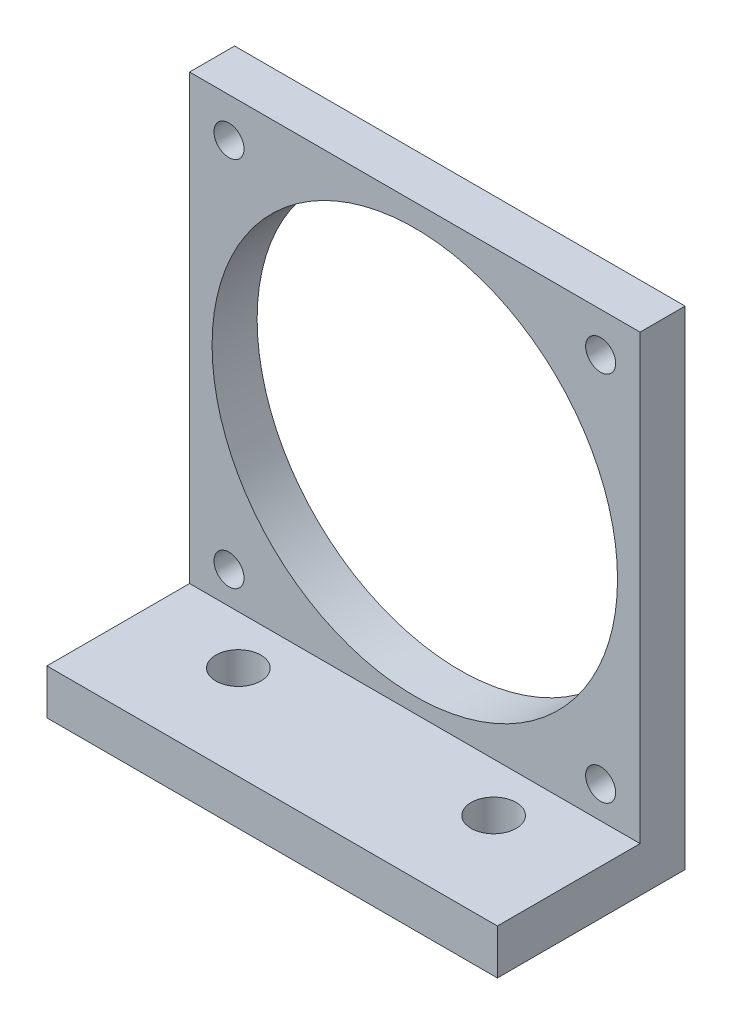
ISO-10303-21;
HEADER;
FILE_DESCRIPTION(('STEP AP214'),'2;1');
FILE_NAME('part.step','',(''),(''),'','','');
FILE_SCHEMA(('AUTOMOTIVE_DESIGN { 1 0 10303 214 1 1 1 1 }'));
ENDSEC;
DATA;
#1=APPLICATION_CONTEXT('core data for automotive mechanical design processes');
#2=APPLICATION_PROTOCOL_DEFINITION('international standard','automotive_design',2000,#1);
#3=PRODUCT_CONTEXT('',#1,'mechanical');
#4=PRODUCT('Part','Part','',(#3));
#5=PRODUCT_RELATED_PRODUCT_CATEGORY('part','',(#4));
#6=PRODUCT_DEFINITION_FORMATION('','',#4);
#7=PRODUCT_DEFINITION_CONTEXT('part definition',#1,'design');
#8=PRODUCT_DEFINITION('design','',#6,#7);
#9=PRODUCT_DEFINITION_SHAPE('','',#8);
#10=(LENGTH_UNIT() NAMED_UNIT(*) SI_UNIT(.MILLI.,.METRE.));
#11=(NAMED_UNIT(*) PLANE_ANGLE_UNIT() SI_UNIT($,.RADIAN.));
#12=(NAMED_UNIT(*) SI_UNIT($,.STERADIAN.) SOLID_ANGLE_UNIT());
#13=UNCERTAINTY_MEASURE_WITH_UNIT(LENGTH_MEASURE(1.E-05),#10,'distance_accuracy_value','');
#14=(GEOMETRIC_REPRESENTATION_CONTEXT(3) GLOBAL_UNCERTAINTY_ASSIGNED_CONTEXT((#13)) GLOBAL_UNIT_ASSIGNED_CONTEXT((#10,
#11,#12)) REPRESENTATION_CONTEXT('',''));
#15=CARTESIAN_POINT('',(0.,0.,0.));
#16=DIRECTION('',(0.,0.,1.));
#17=DIRECTION('',(1.,0.,0.));
#18=AXIS2_PLACEMENT_3D('',#15,#16,#17);
#19=CARTESIAN_POINT('',(0.,0.,6.));
#20=DIRECTION('',(0.,0.,-1.));
#21=DIRECTION('',(-1.,0.,0.));
#22=AXIS2_PLACEMENT_3D('',#19,#20,#21);
#23=PLANE('',#22);
#24=CARTESIAN_POINT('',(5.25126265847083,59.7487373415292,6.));
#25=DIRECTION('',(0.,0.,-1.));
#26=DIRECTION('',(-1.,0.,0.));
#27=AXIS2_PLACEMENT_3D('',#24,#25,#26);
#28=CIRCLE('',#27,2.);
#29=CARTESIAN_POINT('',(3.25126265847083,59.7487373415292,6.));
#30=VERTEX_POINT('',#29);
#31=EDGE_CURVE('E196',#30,#30,#28,.F.);
#32=ORIENTED_EDGE('',*,*,#31,.F.);
#33=EDGE_LOOP('',(#32));
#34=FACE_BOUND('',#33,.T.);
#35=CARTESIAN_POINT('',(54.7487373415292,10.2512626584708,6.));
#36=DIRECTION('',(0.,0.,-1.));
#37=DIRECTION('',(-1.,0.,0.));
#38=AXIS2_PLACEMENT_3D('',#35,#36,#37);
#39=CIRCLE('',#38,2.);
#40=CARTESIAN_POINT('',(52.7487373415292,10.2512626584708,6.));
#41=VERTEX_POINT('',#40);
#42=EDGE_CURVE('E197',#41,#41,#39,.F.);
#43=ORIENTED_EDGE('',*,*,#42,.F.);
#44=EDGE_LOOP('',(#43));
#45=FACE_BOUND('',#44,.T.);
#46=CARTESIAN_POINT('',(5.25126265847083,10.2512626584708,6.));
#47=DIRECTION('',(0.,0.,-1.));
#48=DIRECTION('',(-1.,0.,0.));
#49=AXIS2_PLACEMENT_3D('',#46,#47,#48);
#50=CIRCLE('',#49,2.);
#51=CARTESIAN_POINT('',(3.25126265847083,10.2512626584708,6.));
#52=VERTEX_POINT('',#51);
#53=EDGE_CURVE('E204',#52,#52,#50,.F.);
#54=ORIENTED_EDGE('',*,*,#53,.F.);
#55=EDGE_LOOP('',(#54));
#56=FACE_BOUND('',#55,.T.);
#57=CARTESIAN_POINT('',(54.7487373415292,59.7487373415292,6.));
#58=DIRECTION('',(0.,0.,-1.));
#59=DIRECTION('',(-1.,0.,0.));
#60=AXIS2_PLACEMENT_3D('',#57,#58,#59);
#61=CIRCLE('',#60,2.);
#62=CARTESIAN_POINT('',(52.7487373415292,59.7487373415292,6.));
#63=VERTEX_POINT('',#62);
#64=EDGE_CURVE('E209',#63,#63,#61,.F.);
#65=ORIENTED_EDGE('',*,*,#64,.F.);
#66=EDGE_LOOP('',(#65));
#67=FACE_BOUND('',#66,.T.);
#68=CARTESIAN_POINT('',(30.,35.,6.));
#69=DIRECTION('',(0.,0.,-1.));
#70=DIRECTION('',(-1.,0.,0.));
#71=AXIS2_PLACEMENT_3D('',#68,#69,#70);
#72=CIRCLE('',#71,27.);
#73=CARTESIAN_POINT('',(3.,35.,6.));
#74=VERTEX_POINT('',#73);
#75=EDGE_CURVE('E184',#74,#74,#72,.F.);
#76=ORIENTED_EDGE('',*,*,#75,.F.);
#77=EDGE_LOOP('',(#76));
#78=FACE_BOUND('',#77,.T.);
#79=DIRECTION('',(-1.,0.,0.));
#80=VECTOR('',#79,1.);
#81=CARTESIAN_POINT('',(0.,6.,6.));
#82=LINE('',#81,#80);
#83=CARTESIAN_POINT('',(60.,6.,6.));
#84=VERTEX_POINT('',#83);
#85=CARTESIAN_POINT('',(0.,6.,6.));
#86=VERTEX_POINT('',#85);
#87=EDGE_CURVE('E48',#84,#86,#82,.T.);
#88=ORIENTED_EDGE('',*,*,#87,.F.);
#89=DIRECTION('',(0.,1.,0.));
#90=VECTOR('',#89,1.);
#91=CARTESIAN_POINT('',(60.,0.,6.));
#92=LINE('',#91,#90);
#93=CARTESIAN_POINT('',(60.,65.,6.));
#94=VERTEX_POINT('',#93);
#95=EDGE_CURVE('E137',#84,#94,#92,.T.);
#96=ORIENTED_EDGE('',*,*,#95,.T.);
#97=DIRECTION('',(-1.,0.,0.));
#98=VECTOR('',#97,1.);
#99=CARTESIAN_POINT('',(0.,65.,6.));
#100=LINE('',#99,#98);
#101=CARTESIAN_POINT('',(0.,65.,6.));
#102=VERTEX_POINT('',#101);
#103=EDGE_CURVE('E54',#94,#102,#100,.T.);
#104=ORIENTED_EDGE('',*,*,#103,.T.);
#105=DIRECTION('',(0.,-1.,0.));
#106=VECTOR('',#105,1.);
#107=CARTESIAN_POINT('',(0.,0.,6.));
#108=LINE('',#107,#106);
#109=EDGE_CURVE('E83',#102,#86,#108,.T.);
#110=ORIENTED_EDGE('',*,*,#109,.T.);
#111=EDGE_LOOP('',(#88,#96,#104,#110));
#112=FACE_BOUND('',#111,.T.);
#113=ADVANCED_FACE('F33',(#34,#45,#56,#67,#78,#112),#23,.F.);
#114=CARTESIAN_POINT('',(0.,0.,6.));
#115=DIRECTION('',(1.,0.,0.));
#116=DIRECTION('',(0.,1.,0.));
#117=AXIS2_PLACEMENT_3D('',#114,#115,#116);
#118=PLANE('',#117);
#119=DIRECTION('',(0.,-1.,0.));
#120=VECTOR('',#119,1.);
#121=CARTESIAN_POINT('',(0.,0.,0.));
#122=LINE('',#121,#120);
#123=CARTESIAN_POINT('',(0.,65.,0.));
#124=VERTEX_POINT('',#123);
#125=CARTESIAN_POINT('',(0.,0.,0.));
#126=VERTEX_POINT('',#125);
#127=EDGE_CURVE('E89',#124,#126,#122,.T.);
#128=ORIENTED_EDGE('',*,*,#127,.T.);
#129=DIRECTION('',(0.,0.,-1.));
#130=VECTOR('',#129,1.);
#131=CARTESIAN_POINT('',(0.,0.,6.));
#132=LINE('',#131,#130);
#133=CARTESIAN_POINT('',(0.,0.,25.));
#134=VERTEX_POINT('',#133);
#135=EDGE_CURVE('E11',#134,#126,#132,.T.);
#136=ORIENTED_EDGE('',*,*,#135,.F.);
#137=DIRECTION('',(0.,-1.,0.));
#138=VECTOR('',#137,1.);
#139=CARTESIAN_POINT('',(0.,0.,25.));
#140=LINE('',#139,#138);
#141=CARTESIAN_POINT('',(0.,6.,25.));
#142=VERTEX_POINT('',#141);
#143=EDGE_CURVE('E126',#142,#134,#140,.T.);
#144=ORIENTED_EDGE('',*,*,#143,.F.);
#145=DIRECTION('',(0.,0.,-1.));
#146=VECTOR('',#145,1.);
#147=CARTESIAN_POINT('',(0.,6.,25.));
#148=LINE('',#147,#146);
#149=EDGE_CURVE('E98',#142,#86,#148,.T.);
#150=ORIENTED_EDGE('',*,*,#149,.T.);
#151=ORIENTED_EDGE('',*,*,#109,.F.);
#152=DIRECTION('',(0.,0.,-1.));
#153=VECTOR('',#152,1.);
#154=CARTESIAN_POINT('',(0.,65.,6.));
#155=LINE('',#154,#153);
#156=EDGE_CURVE('E76',#102,#124,#155,.T.);
#157=ORIENTED_EDGE('',*,*,#156,.T.);
#158=EDGE_LOOP('',(#128,#136,#144,#150,#151,#157));
#159=FACE_BOUND('',#158,.T.);
#160=ADVANCED_FACE('F35',(#159),#118,.F.);
#161=CARTESIAN_POINT('',(0.,0.,6.));
#162=DIRECTION('',(0.,1.,0.));
#163=DIRECTION('',(0.,0.,1.));
#164=AXIS2_PLACEMENT_3D('',#161,#162,#163);
#165=PLANE('',#164);
#166=CARTESIAN_POINT('',(13.,0.,12.5));
#167=DIRECTION('',(0.,-1.,0.));
#168=DIRECTION('',(0.,0.,-1.));
#169=AXIS2_PLACEMENT_3D('',#166,#167,#168);
#170=CIRCLE('',#169,3.);
#171=CARTESIAN_POINT('',(13.,0.,9.5));
#172=VERTEX_POINT('',#171);
#173=EDGE_CURVE('E178',#172,#172,#170,.T.);
#174=ORIENTED_EDGE('',*,*,#173,.F.);
#175=EDGE_LOOP('',(#174));
#176=FACE_BOUND('',#175,.T.);
#177=CARTESIAN_POINT('',(47.,0.,12.5000000000002));
#178=DIRECTION('',(0.,-1.,0.));
#179=DIRECTION('',(0.,0.,-1.));
#180=AXIS2_PLACEMENT_3D('',#177,#178,#179);
#181=CIRCLE('',#180,3.);
#182=CARTESIAN_POINT('',(47.,0.,9.50000000000024));
#183=VERTEX_POINT('',#182);
#184=EDGE_CURVE('E181',#183,#183,#181,.T.);
#185=ORIENTED_EDGE('',*,*,#184,.F.);
#186=EDGE_LOOP('',(#185));
#187=FACE_BOUND('',#186,.T.);
#188=DIRECTION('',(1.,0.,0.));
#189=VECTOR('',#188,1.);
#190=CARTESIAN_POINT('',(0.,0.,0.));
#191=LINE('',#190,#189);
#192=CARTESIAN_POINT('',(60.,0.,0.));
#193=VERTEX_POINT('',#192);
#194=EDGE_CURVE('E93',#126,#193,#191,.T.);
#195=ORIENTED_EDGE('',*,*,#194,.T.);
#196=DIRECTION('',(0.,0.,-1.));
#197=VECTOR('',#196,1.);
#198=CARTESIAN_POINT('',(60.,0.,6.));
#199=LINE('',#198,#197);
#200=CARTESIAN_POINT('',(60.,0.,25.));
#201=VERTEX_POINT('',#200);
#202=EDGE_CURVE('E41',#201,#193,#199,.T.);
#203=ORIENTED_EDGE('',*,*,#202,.F.);
#204=DIRECTION('',(1.,0.,0.));
#205=VECTOR('',#204,1.);
#206=CARTESIAN_POINT('',(0.,0.,25.));
#207=LINE('',#206,#205);
#208=EDGE_CURVE('E118',#134,#201,#207,.T.);
#209=ORIENTED_EDGE('',*,*,#208,.F.);
#210=ORIENTED_EDGE('',*,*,#135,.T.);
#211=EDGE_LOOP('',(#195,#203,#209,#210));
#212=FACE_BOUND('',#211,.T.);
#213=ADVANCED_FACE('F116',(#176,#187,#212),#165,.F.);
#214=CARTESIAN_POINT('',(60.,0.,6.));
#215=DIRECTION('',(-1.,0.,0.));
#216=DIRECTION('',(0.,-1.,0.));
#217=AXIS2_PLACEMENT_3D('',#214,#215,#216);
#218=PLANE('',#217);
#219=DIRECTION('',(0.,1.,0.));
#220=VECTOR('',#219,1.);
#221=CARTESIAN_POINT('',(60.,0.,0.));
#222=LINE('',#221,#220);
#223=CARTESIAN_POINT('',(60.,65.,0.));
#224=VERTEX_POINT('',#223);
#225=EDGE_CURVE('E84',#193,#224,#222,.T.);
#226=ORIENTED_EDGE('',*,*,#225,.T.);
#227=DIRECTION('',(0.,0.,-1.));
#228=VECTOR('',#227,1.);
#229=CARTESIAN_POINT('',(60.,65.,6.));
#230=LINE('',#229,#228);
#231=EDGE_CURVE('E79',#94,#224,#230,.T.);
#232=ORIENTED_EDGE('',*,*,#231,.F.);
#233=ORIENTED_EDGE('',*,*,#95,.F.);
#234=DIRECTION('',(0.,0.,-1.));
#235=VECTOR('',#234,1.);
#236=CARTESIAN_POINT('',(60.,6.,25.));
#237=LINE('',#236,#235);
#238=CARTESIAN_POINT('',(60.,6.,25.));
#239=VERTEX_POINT('',#238);
#240=EDGE_CURVE('E94',#239,#84,#237,.T.);
#241=ORIENTED_EDGE('',*,*,#240,.F.);
#242=DIRECTION('',(0.,1.,0.));
#243=VECTOR('',#242,1.);
#244=CARTESIAN_POINT('',(60.,0.,25.));
#245=LINE('',#244,#243);
#246=EDGE_CURVE('E112',#201,#239,#245,.T.);
#247=ORIENTED_EDGE('',*,*,#246,.F.);
#248=ORIENTED_EDGE('',*,*,#202,.T.);
#249=EDGE_LOOP('',(#226,#232,#233,#241,#247,#248));
#250=FACE_BOUND('',#249,.T.);
#251=ADVANCED_FACE('F108',(#250),#218,.F.);
#252=CARTESIAN_POINT('',(0.,65.,6.));
#253=DIRECTION('',(0.,-1.,0.));
#254=DIRECTION('',(0.,0.,-1.));
#255=AXIS2_PLACEMENT_3D('',#252,#253,#254);
#256=PLANE('',#255);
#257=DIRECTION('',(-1.,0.,0.));
#258=VECTOR('',#257,1.);
#259=CARTESIAN_POINT('',(0.,65.,0.));
#260=LINE('',#259,#258);
#261=EDGE_CURVE('E73',#224,#124,#260,.T.);
#262=ORIENTED_EDGE('',*,*,#261,.T.);
#263=ORIENTED_EDGE('',*,*,#156,.F.);
#264=ORIENTED_EDGE('',*,*,#103,.F.);
#265=ORIENTED_EDGE('',*,*,#231,.T.);
#266=EDGE_LOOP('',(#262,#263,#264,#265));
#267=FACE_BOUND('',#266,.T.);
#268=ADVANCED_FACE('F75',(#267),#256,.F.);
#269=CARTESIAN_POINT('',(0.,0.,0.));
#270=DIRECTION('',(0.,0.,-1.));
#271=DIRECTION('',(-1.,0.,0.));
#272=AXIS2_PLACEMENT_3D('',#269,#270,#271);
#273=PLANE('',#272);
#274=CARTESIAN_POINT('',(5.25126265847083,59.7487373415292,0.));
#275=DIRECTION('',(0.,0.,-1.));
#276=DIRECTION('',(-1.,0.,0.));
#277=AXIS2_PLACEMENT_3D('',#274,#275,#276);
#278=CIRCLE('',#277,2.);
#279=CARTESIAN_POINT('',(3.25126265847083,59.7487373415292,0.));
#280=VERTEX_POINT('',#279);
#281=EDGE_CURVE('E200',#280,#280,#278,.T.);
#282=ORIENTED_EDGE('',*,*,#281,.F.);
#283=EDGE_LOOP('',(#282));
#284=FACE_BOUND('',#283,.T.);
#285=CARTESIAN_POINT('',(54.7487373415292,10.2512626584708,0.));
#286=DIRECTION('',(0.,0.,-1.));
#287=DIRECTION('',(-1.,0.,0.));
#288=AXIS2_PLACEMENT_3D('',#285,#286,#287);
#289=CIRCLE('',#288,2.);
#290=CARTESIAN_POINT('',(52.7487373415292,10.2512626584708,0.));
#291=VERTEX_POINT('',#290);
#292=EDGE_CURVE('E201',#291,#291,#289,.T.);
#293=ORIENTED_EDGE('',*,*,#292,.F.);
#294=EDGE_LOOP('',(#293));
#295=FACE_BOUND('',#294,.T.);
#296=CARTESIAN_POINT('',(5.25126265847083,10.2512626584708,0.));
#297=DIRECTION('',(0.,0.,-1.));
#298=DIRECTION('',(-1.,0.,0.));
#299=AXIS2_PLACEMENT_3D('',#296,#297,#298);
#300=CIRCLE('',#299,2.);
#301=CARTESIAN_POINT('',(3.25126265847083,10.2512626584708,0.));
#302=VERTEX_POINT('',#301);
#303=EDGE_CURVE('E212',#302,#302,#300,.T.);
#304=ORIENTED_EDGE('',*,*,#303,.F.);
#305=EDGE_LOOP('',(#304));
#306=FACE_BOUND('',#305,.T.);
#307=CARTESIAN_POINT('',(54.7487373415292,59.7487373415292,0.));
#308=DIRECTION('',(0.,0.,-1.));
#309=DIRECTION('',(-1.,0.,0.));
#310=AXIS2_PLACEMENT_3D('',#307,#308,#309);
#311=CIRCLE('',#310,2.);
#312=CARTESIAN_POINT('',(52.7487373415292,59.7487373415292,0.));
#313=VERTEX_POINT('',#312);
#314=EDGE_CURVE('E213',#313,#313,#311,.T.);
#315=ORIENTED_EDGE('',*,*,#314,.F.);
#316=EDGE_LOOP('',(#315));
#317=FACE_BOUND('',#316,.T.);
#318=CARTESIAN_POINT('',(30.,35.,0.));
#319=DIRECTION('',(0.,0.,-1.));
#320=DIRECTION('',(-1.,0.,0.));
#321=AXIS2_PLACEMENT_3D('',#318,#319,#320);
#322=CIRCLE('',#321,27.);
#323=CARTESIAN_POINT('',(3.,35.,0.));
#324=VERTEX_POINT('',#323);
#325=EDGE_CURVE('E188',#324,#324,#322,.T.);
#326=ORIENTED_EDGE('',*,*,#325,.F.);
#327=EDGE_LOOP('',(#326));
#328=FACE_BOUND('',#327,.T.);
#329=ORIENTED_EDGE('',*,*,#127,.F.);
#330=ORIENTED_EDGE('',*,*,#261,.F.);
#331=ORIENTED_EDGE('',*,*,#225,.F.);
#332=ORIENTED_EDGE('',*,*,#194,.F.);
#333=EDGE_LOOP('',(#329,#330,#331,#332));
#334=FACE_BOUND('',#333,.T.);
#335=ADVANCED_FACE('F92',(#284,#295,#306,#317,#328,#334),#273,.T.);
#336=CARTESIAN_POINT('',(0.,6.,25.));
#337=DIRECTION('',(0.,-1.,0.));
#338=DIRECTION('',(0.,0.,-1.));
#339=AXIS2_PLACEMENT_3D('',#336,#337,#338);
#340=PLANE('',#339);
#341=CARTESIAN_POINT('',(13.,6.,12.5));
#342=DIRECTION('',(0.,-1.,0.));
#343=DIRECTION('',(0.,0.,-1.));
#344=AXIS2_PLACEMENT_3D('',#341,#342,#343);
#345=CIRCLE('',#344,3.);
#346=CARTESIAN_POINT('',(13.,6.,9.5));
#347=VERTEX_POINT('',#346);
#348=EDGE_CURVE('E135',#347,#347,#345,.F.);
#349=ORIENTED_EDGE('',*,*,#348,.F.);
#350=EDGE_LOOP('',(#349));
#351=FACE_BOUND('',#350,.T.);
#352=CARTESIAN_POINT('',(47.,6.,12.5000000000002));
#353=DIRECTION('',(0.,-1.,0.));
#354=DIRECTION('',(0.,0.,-1.));
#355=AXIS2_PLACEMENT_3D('',#352,#353,#354);
#356=CIRCLE('',#355,3.);
#357=CARTESIAN_POINT('',(47.,6.,9.50000000000024));
#358=VERTEX_POINT('',#357);
#359=EDGE_CURVE('E183',#358,#358,#356,.F.);
#360=ORIENTED_EDGE('',*,*,#359,.F.);
#361=EDGE_LOOP('',(#360));
#362=FACE_BOUND('',#361,.T.);
#363=ORIENTED_EDGE('',*,*,#87,.T.);
#364=ORIENTED_EDGE('',*,*,#149,.F.);
#365=DIRECTION('',(-1.,0.,0.));
#366=VECTOR('',#365,1.);
#367=CARTESIAN_POINT('',(0.,6.,25.));
#368=LINE('',#367,#366);
#369=EDGE_CURVE('E128',#239,#142,#368,.T.);
#370=ORIENTED_EDGE('',*,*,#369,.F.);
#371=ORIENTED_EDGE('',*,*,#240,.T.);
#372=EDGE_LOOP('',(#363,#364,#370,#371));
#373=FACE_BOUND('',#372,.T.);
#374=ADVANCED_FACE('F140',(#351,#362,#373),#340,.F.);
#375=CARTESIAN_POINT('',(0.,0.,25.));
#376=DIRECTION('',(0.,0.,-1.));
#377=DIRECTION('',(-1.,0.,0.));
#378=AXIS2_PLACEMENT_3D('',#375,#376,#377);
#379=PLANE('',#378);
#380=ORIENTED_EDGE('',*,*,#143,.T.);
#381=ORIENTED_EDGE('',*,*,#208,.T.);
#382=ORIENTED_EDGE('',*,*,#246,.T.);
#383=ORIENTED_EDGE('',*,*,#369,.T.);
#384=EDGE_LOOP('',(#380,#381,#382,#383));
#385=FACE_BOUND('',#384,.T.);
#386=ADVANCED_FACE('F123',(#385),#379,.F.);
#387=CARTESIAN_POINT('',(47.,65.001,12.5000000000002));
#388=DIRECTION('',(0.,-1.,0.));
#389=DIRECTION('',(0.,0.,-1.));
#390=AXIS2_PLACEMENT_3D('',#387,#388,#389);
#391=CYLINDRICAL_SURFACE('',#390,3.);
#392=ORIENTED_EDGE('',*,*,#184,.T.);
#393=EDGE_LOOP('',(#392));
#394=FACE_BOUND('',#393,.T.);
#395=ORIENTED_EDGE('',*,*,#359,.T.);
#396=EDGE_LOOP('',(#395));
#397=FACE_BOUND('',#396,.T.);
#398=ADVANCED_FACE('F153',(#394,#397),#391,.F.);
#399=CARTESIAN_POINT('',(13.,65.001,12.5));
#400=DIRECTION('',(0.,-1.,0.));
#401=DIRECTION('',(0.,0.,-1.));
#402=AXIS2_PLACEMENT_3D('',#399,#400,#401);
#403=CYLINDRICAL_SURFACE('',#402,3.);
#404=ORIENTED_EDGE('',*,*,#173,.T.);
#405=EDGE_LOOP('',(#404));
#406=FACE_BOUND('',#405,.T.);
#407=ORIENTED_EDGE('',*,*,#348,.T.);
#408=EDGE_LOOP('',(#407));
#409=FACE_BOUND('',#408,.T.);
#410=ADVANCED_FACE('F233',(#406,#409),#403,.F.);
#411=CARTESIAN_POINT('',(30.,35.,25.001));
#412=DIRECTION('',(0.,0.,-1.));
#413=DIRECTION('',(-1.,0.,0.));
#414=AXIS2_PLACEMENT_3D('',#411,#412,#413);
#415=CYLINDRICAL_SURFACE('',#414,27.);
#416=ORIENTED_EDGE('',*,*,#325,.T.);
#417=EDGE_LOOP('',(#416));
#418=FACE_BOUND('',#417,.T.);
#419=ORIENTED_EDGE('',*,*,#75,.T.);
#420=EDGE_LOOP('',(#419));
#421=FACE_BOUND('',#420,.T.);
#422=ADVANCED_FACE('F229',(#418,#421),#415,.F.);
#423=CARTESIAN_POINT('',(54.7487373415292,59.7487373415292,25.001));
#424=DIRECTION('',(0.,0.,-1.));
#425=DIRECTION('',(-1.,0.,0.));
#426=AXIS2_PLACEMENT_3D('',#423,#424,#425);
#427=CYLINDRICAL_SURFACE('',#426,2.);
#428=ORIENTED_EDGE('',*,*,#314,.T.);
#429=EDGE_LOOP('',(#428));
#430=FACE_BOUND('',#429,.T.);
#431=ORIENTED_EDGE('',*,*,#64,.T.);
#432=EDGE_LOOP('',(#431));
#433=FACE_BOUND('',#432,.T.);
#434=ADVANCED_FACE('F232',(#430,#433),#427,.F.);
#435=CARTESIAN_POINT('',(5.25126265847083,10.2512626584708,25.001));
#436=DIRECTION('',(0.,0.,-1.));
#437=DIRECTION('',(-1.,0.,0.));
#438=AXIS2_PLACEMENT_3D('',#435,#436,#437);
#439=CYLINDRICAL_SURFACE('',#438,2.);
#440=ORIENTED_EDGE('',*,*,#303,.T.);
#441=EDGE_LOOP('',(#440));
#442=FACE_BOUND('',#441,.T.);
#443=ORIENTED_EDGE('',*,*,#53,.T.);
#444=EDGE_LOOP('',(#443));
#445=FACE_BOUND('',#444,.T.);
#446=ADVANCED_FACE('F221',(#442,#445),#439,.F.);
#447=CARTESIAN_POINT('',(54.7487373415292,10.2512626584708,25.001));
#448=DIRECTION('',(0.,0.,-1.));
#449=DIRECTION('',(-1.,0.,0.));
#450=AXIS2_PLACEMENT_3D('',#447,#448,#449);
#451=CYLINDRICAL_SURFACE('',#450,2.);
#452=ORIENTED_EDGE('',*,*,#292,.T.);
#453=EDGE_LOOP('',(#452));
#454=FACE_BOUND('',#453,.T.);
#455=ORIENTED_EDGE('',*,*,#42,.T.);
#456=EDGE_LOOP('',(#455));
#457=FACE_BOUND('',#456,.T.);
#458=ADVANCED_FACE('F246',(#454,#457),#451,.F.);
#459=CARTESIAN_POINT('',(5.25126265847083,59.7487373415292,25.001));
#460=DIRECTION('',(0.,0.,-1.));
#461=DIRECTION('',(-1.,0.,0.));
#462=AXIS2_PLACEMENT_3D('',#459,#460,#461);
#463=CYLINDRICAL_SURFACE('',#462,2.);
#464=ORIENTED_EDGE('',*,*,#281,.T.);
#465=EDGE_LOOP('',(#464));
#466=FACE_BOUND('',#465,.T.);
#467=ORIENTED_EDGE('',*,*,#31,.T.);
#468=EDGE_LOOP('',(#467));
#469=FACE_BOUND('',#468,.T.);
#470=ADVANCED_FACE('F299',(#466,#469),#463,.F.);
#471=CLOSED_SHELL('',(#113,#160,#213,#251,#268,#335,#374,#386,#398,#410,#422,#434,#446,#458,#470));
#472=MANIFOLD_SOLID_BREP('B2',#471);
#473=ADVANCED_BREP_SHAPE_REPRESENTATION('',(#18,#472),#14);
#474=SHAPE_DEFINITION_REPRESENTATION(#9,#473);
ENDSEC;
END-ISO-10303-21;
